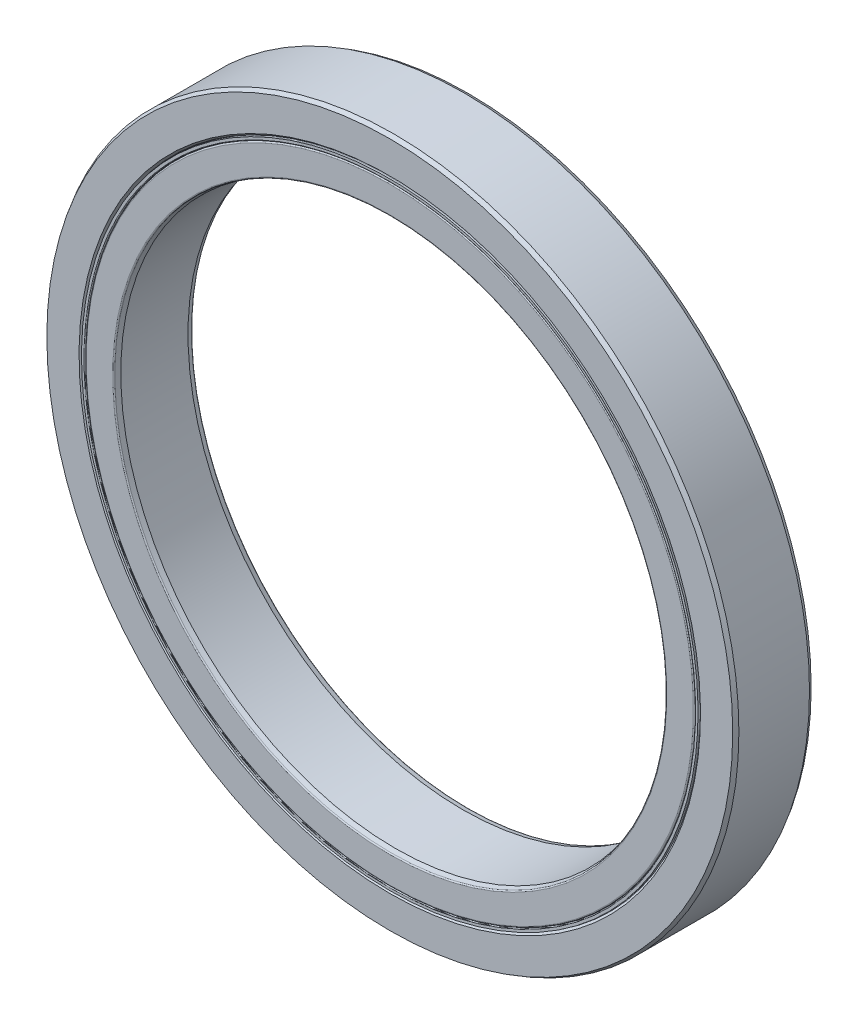
ISO-10303-21;
HEADER;
FILE_DESCRIPTION(('STEP AP214'),'2;1');
FILE_NAME('part.step','',(''),(''),'','','');
FILE_SCHEMA(('AUTOMOTIVE_DESIGN { 1 0 10303 214 1 1 1 1 }'));
ENDSEC;
DATA;
#1=APPLICATION_CONTEXT('core data for automotive mechanical design processes');
#2=APPLICATION_PROTOCOL_DEFINITION('international standard','automotive_design',2000,#1);
#3=PRODUCT_CONTEXT('',#1,'mechanical');
#4=PRODUCT('Part','Part','',(#3));
#5=PRODUCT_RELATED_PRODUCT_CATEGORY('part','',(#4));
#6=PRODUCT_DEFINITION_FORMATION('','',#4);
#7=PRODUCT_DEFINITION_CONTEXT('part definition',#1,'design');
#8=PRODUCT_DEFINITION('design','',#6,#7);
#9=PRODUCT_DEFINITION_SHAPE('','',#8);
#10=(LENGTH_UNIT() NAMED_UNIT(*) SI_UNIT(.MILLI.,.METRE.));
#11=(NAMED_UNIT(*) PLANE_ANGLE_UNIT() SI_UNIT($,.RADIAN.));
#12=(NAMED_UNIT(*) SI_UNIT($,.STERADIAN.) SOLID_ANGLE_UNIT());
#13=UNCERTAINTY_MEASURE_WITH_UNIT(LENGTH_MEASURE(1.E-05),#10,'distance_accuracy_value','');
#14=(GEOMETRIC_REPRESENTATION_CONTEXT(3) GLOBAL_UNCERTAINTY_ASSIGNED_CONTEXT((#13)) GLOBAL_UNIT_ASSIGNED_CONTEXT((#10,
#11,#12)) REPRESENTATION_CONTEXT('',''));
#15=CARTESIAN_POINT('',(0.,0.,0.));
#16=DIRECTION('',(0.,0.,1.));
#17=DIRECTION('',(1.,0.,0.));
#18=AXIS2_PLACEMENT_3D('',#15,#16,#17);
#19=CARTESIAN_POINT('',(0.,19.4316666666665,1.6875));
#20=DIRECTION('',(0.,0.,1.));
#21=DIRECTION('',(0.,-1.,0.));
#22=AXIS2_PLACEMENT_3D('',#19,#20,#21);
#23=PLANE('',#22);
#24=CARTESIAN_POINT('',(0.,0.,1.6875));
#25=DIRECTION('',(0.,0.,1.));
#26=DIRECTION('',(0.,-1.,0.));
#27=AXIS2_PLACEMENT_3D('',#24,#25,#26);
#28=CIRCLE('',#27,19.6116666666665);
#29=CARTESIAN_POINT('',(0.,-19.6116666666665,1.68749999999999));
#30=VERTEX_POINT('',#29);
#31=EDGE_CURVE('E11',#30,#30,#28,.T.);
#32=ORIENTED_EDGE('',*,*,#31,.F.);
#33=EDGE_LOOP('',(#32));
#34=FACE_BOUND('',#33,.T.);
#35=CARTESIAN_POINT('',(0.,0.,1.6875));
#36=DIRECTION('',(0.,0.,1.));
#37=DIRECTION('',(0.,-1.,0.));
#38=AXIS2_PLACEMENT_3D('',#35,#36,#37);
#39=CIRCLE('',#38,19.4316666666665);
#40=CARTESIAN_POINT('',(0.,-19.4316666666665,1.68749999999999));
#41=VERTEX_POINT('',#40);
#42=EDGE_CURVE('E84',#41,#41,#39,.T.);
#43=ORIENTED_EDGE('',*,*,#42,.T.);
#44=EDGE_LOOP('',(#43));
#45=FACE_BOUND('',#44,.T.);
#46=ADVANCED_FACE('F51',(#34,#45),#23,.F.);
#47=CARTESIAN_POINT('',(0.,0.,2.5));
#48=DIRECTION('',(0.,0.,1.));
#49=DIRECTION('',(0.,-1.,0.));
#50=AXIS2_PLACEMENT_3D('',#47,#48,#49);
#51=CYLINDRICAL_SURFACE('',#50,19.6116666666665);
#52=CARTESIAN_POINT('',(0.,0.,2.36643698985866));
#53=DIRECTION('',(0.,0.,1.));
#54=DIRECTION('',(0.,-1.,0.));
#55=AXIS2_PLACEMENT_3D('',#52,#53,#54);
#56=CIRCLE('',#55,19.6116666666665);
#57=CARTESIAN_POINT('',(0.,-19.6116666666665,2.36643698985866));
#58=VERTEX_POINT('',#57);
#59=EDGE_CURVE('E58',#58,#58,#56,.T.);
#60=ORIENTED_EDGE('',*,*,#59,.F.);
#61=EDGE_LOOP('',(#60));
#62=FACE_BOUND('',#61,.T.);
#63=ORIENTED_EDGE('',*,*,#31,.T.);
#64=EDGE_LOOP('',(#63));
#65=FACE_BOUND('',#64,.T.);
#66=ADVANCED_FACE('F117',(#62,#65),#51,.T.);
#67=CARTESIAN_POINT('',(0.,0.,2.36643698985866));
#68=DIRECTION('',(0.,0.,-1.));
#69=DIRECTION('',(0.,1.,0.));
#70=AXIS2_PLACEMENT_3D('',#67,#68,#69);
#71=CONICAL_SURFACE('',#70,19.6116666666665,0.174532925199362);
#72=CARTESIAN_POINT('',(0.,0.,2.41075333874421));
#73=DIRECTION('',(0.,0.,1.));
#74=DIRECTION('',(0.,-1.,0.));
#75=AXIS2_PLACEMENT_3D('',#72,#73,#74);
#76=CIRCLE('',#75,19.6038524986715);
#77=CARTESIAN_POINT('',(0.,-19.6038524986715,2.41075333874421));
#78=VERTEX_POINT('',#77);
#79=EDGE_CURVE('E64',#78,#78,#76,.T.);
#80=ORIENTED_EDGE('',*,*,#79,.F.);
#81=EDGE_LOOP('',(#80));
#82=FACE_BOUND('',#81,.T.);
#83=ORIENTED_EDGE('',*,*,#59,.T.);
#84=EDGE_LOOP('',(#83));
#85=FACE_BOUND('',#84,.T.);
#86=ADVANCED_FACE('F112',(#82,#85),#71,.T.);
#87=CARTESIAN_POINT('',(0.,0.,2.4075));
#88=DIRECTION('',(0.,0.,1.));
#89=DIRECTION('',(0.,-1.,0.));
#90=AXIS2_PLACEMENT_3D('',#87,#88,#89);
#91=TOROIDAL_SURFACE('',#90,19.5854018977984,0.0187352311318617);
#92=CARTESIAN_POINT('',(0.,0.,2.4075));
#93=DIRECTION('',(0.,0.,1.));
#94=DIRECTION('',(0.,-1.,0.));
#95=AXIS2_PLACEMENT_3D('',#92,#93,#94);
#96=CIRCLE('',#95,19.5666666666665);
#97=CARTESIAN_POINT('',(0.,-19.5666666666665,2.4075));
#98=VERTEX_POINT('',#97);
#99=EDGE_CURVE('E70',#98,#98,#96,.T.);
#100=ORIENTED_EDGE('',*,*,#99,.F.);
#101=EDGE_LOOP('',(#100));
#102=FACE_BOUND('',#101,.T.);
#103=ORIENTED_EDGE('',*,*,#79,.T.);
#104=EDGE_LOOP('',(#103));
#105=FACE_BOUND('',#104,.T.);
#106=ADVANCED_FACE('F106',(#102,#105),#91,.T.);
#107=CARTESIAN_POINT('',(0.,0.,2.5));
#108=DIRECTION('',(0.,0.,1.));
#109=DIRECTION('',(0.,-1.,0.));
#110=AXIS2_PLACEMENT_3D('',#107,#108,#109);
#111=CYLINDRICAL_SURFACE('',#110,19.5666666666665);
#112=CARTESIAN_POINT('',(0.,0.,2.4325));
#113=DIRECTION('',(0.,0.,1.));
#114=DIRECTION('',(0.,-1.,0.));
#115=AXIS2_PLACEMENT_3D('',#112,#113,#114);
#116=CIRCLE('',#115,19.5666666666665);
#117=CARTESIAN_POINT('',(0.,-19.5666666666665,2.4325));
#118=VERTEX_POINT('',#117);
#119=EDGE_CURVE('E76',#118,#118,#116,.T.);
#120=ORIENTED_EDGE('',*,*,#119,.F.);
#121=EDGE_LOOP('',(#120));
#122=FACE_BOUND('',#121,.T.);
#123=ORIENTED_EDGE('',*,*,#99,.T.);
#124=EDGE_LOOP('',(#123));
#125=FACE_BOUND('',#124,.T.);
#126=ADVANCED_FACE('F100',(#122,#125),#111,.T.);
#127=CARTESIAN_POINT('',(0.,0.,2.4325));
#128=DIRECTION('',(0.,0.,1.));
#129=DIRECTION('',(0.,-1.,0.));
#130=AXIS2_PLACEMENT_3D('',#127,#128,#129);
#131=TOROIDAL_SURFACE('',#130,19.4991666666665,0.0674999999999981);
#132=CARTESIAN_POINT('',(0.,0.,2.4325));
#133=DIRECTION('',(0.,0.,1.));
#134=DIRECTION('',(0.,-1.,0.));
#135=AXIS2_PLACEMENT_3D('',#132,#133,#134);
#136=CIRCLE('',#135,19.4316666666665);
#137=CARTESIAN_POINT('',(0.,-19.4316666666665,2.4325));
#138=VERTEX_POINT('',#137);
#139=EDGE_CURVE('E80',#138,#138,#136,.T.);
#140=ORIENTED_EDGE('',*,*,#139,.F.);
#141=EDGE_LOOP('',(#140));
#142=FACE_BOUND('',#141,.T.);
#143=ORIENTED_EDGE('',*,*,#119,.T.);
#144=EDGE_LOOP('',(#143));
#145=FACE_BOUND('',#144,.T.);
#146=ADVANCED_FACE('F94',(#142,#145),#131,.T.);
#147=CARTESIAN_POINT('',(0.,0.,2.5));
#148=DIRECTION('',(0.,0.,1.));
#149=DIRECTION('',(0.,-1.,0.));
#150=AXIS2_PLACEMENT_3D('',#147,#148,#149);
#151=CYLINDRICAL_SURFACE('',#150,19.4316666666665);
#152=ORIENTED_EDGE('',*,*,#42,.F.);
#153=EDGE_LOOP('',(#152));
#154=FACE_BOUND('',#153,.T.);
#155=ORIENTED_EDGE('',*,*,#139,.T.);
#156=EDGE_LOOP('',(#155));
#157=FACE_BOUND('',#156,.T.);
#158=ADVANCED_FACE('F91',(#154,#157),#151,.F.);
#159=CLOSED_SHELL('',(#46,#66,#86,#106,#126,#146,#158));
#160=MANIFOLD_SOLID_BREP('B2',#159);
#161=CARTESIAN_POINT('',(0.,0.,-2.3441154273188));
#162=DIRECTION('',(0.,0.,1.));
#163=DIRECTION('',(0.,-1.,0.));
#164=AXIS2_PLACEMENT_3D('',#161,#162,#163);
#165=CONICAL_SURFACE('',#164,19.58,0.523598775598301);
#166=CARTESIAN_POINT('',(0.,0.,-2.5));
#167=DIRECTION('',(0.,0.,1.));
#168=DIRECTION('',(0.,-1.,0.));
#169=AXIS2_PLACEMENT_3D('',#166,#167,#168);
#170=CIRCLE('',#169,19.49);
#171=CARTESIAN_POINT('',(0.,-19.49,-2.50000000000001));
#172=VERTEX_POINT('',#171);
#173=EDGE_CURVE('E222',#172,#172,#170,.T.);
#174=ORIENTED_EDGE('',*,*,#173,.F.);
#175=EDGE_LOOP('',(#174));
#176=FACE_BOUND('',#175,.T.);
#177=CARTESIAN_POINT('',(0.,0.,-2.3441154273188));
#178=DIRECTION('',(0.,0.,1.));
#179=DIRECTION('',(0.,-1.,0.));
#180=AXIS2_PLACEMENT_3D('',#177,#178,#179);
#181=CIRCLE('',#180,19.58);
#182=CARTESIAN_POINT('',(0.,-19.58,-2.34411542731881));
#183=VERTEX_POINT('',#182);
#184=EDGE_CURVE('E50',#183,#183,#181,.T.);
#185=ORIENTED_EDGE('',*,*,#184,.T.);
#186=EDGE_LOOP('',(#185));
#187=FACE_BOUND('',#186,.T.);
#188=ADVANCED_FACE('F193',(#176,#187),#165,.F.);
#189=CARTESIAN_POINT('',(0.,0.,2.5));
#190=DIRECTION('',(0.,0.,1.));
#191=DIRECTION('',(0.,-1.,0.));
#192=AXIS2_PLACEMENT_3D('',#189,#190,#191);
#193=CYLINDRICAL_SURFACE('',#192,19.58);
#194=ORIENTED_EDGE('',*,*,#184,.F.);
#195=EDGE_LOOP('',(#194));
#196=FACE_BOUND('',#195,.T.);
#197=CARTESIAN_POINT('',(0.,0.,-1.6875));
#198=DIRECTION('',(0.,0.,1.));
#199=DIRECTION('',(0.,-1.,0.));
#200=AXIS2_PLACEMENT_3D('',#197,#198,#199);
#201=CIRCLE('',#200,19.58);
#202=CARTESIAN_POINT('',(0.,-19.58,-1.68750000000001));
#203=VERTEX_POINT('',#202);
#204=EDGE_CURVE('E200',#203,#203,#201,.T.);
#205=ORIENTED_EDGE('',*,*,#204,.T.);
#206=EDGE_LOOP('',(#205));
#207=FACE_BOUND('',#206,.T.);
#208=ADVANCED_FACE('F231',(#196,#207),#193,.F.);
#209=CARTESIAN_POINT('',(0.,19.58,-1.6875));
#210=DIRECTION('',(0.,0.,-1.));
#211=DIRECTION('',(0.,1.,0.));
#212=AXIS2_PLACEMENT_3D('',#209,#210,#211);
#213=PLANE('',#212);
#214=ORIENTED_EDGE('',*,*,#204,.F.);
#215=EDGE_LOOP('',(#214));
#216=FACE_BOUND('',#215,.T.);
#217=CARTESIAN_POINT('',(0.,0.,-1.6875));
#218=DIRECTION('',(0.,0.,1.));
#219=DIRECTION('',(0.,-1.,0.));
#220=AXIS2_PLACEMENT_3D('',#217,#218,#219);
#221=CIRCLE('',#220,19.6116666666665);
#222=CARTESIAN_POINT('',(0.,-19.6116666666665,-1.68750000000001));
#223=VERTEX_POINT('',#222);
#224=EDGE_CURVE('E206',#223,#223,#221,.T.);
#225=ORIENTED_EDGE('',*,*,#224,.T.);
#226=EDGE_LOOP('',(#225));
#227=FACE_BOUND('',#226,.T.);
#228=ADVANCED_FACE('F235',(#216,#227),#213,.F.);
#229=CARTESIAN_POINT('',(0.,0.,2.5));
#230=DIRECTION('',(0.,0.,1.));
#231=DIRECTION('',(0.,-1.,0.));
#232=AXIS2_PLACEMENT_3D('',#229,#230,#231);
#233=CYLINDRICAL_SURFACE('',#232,19.6116666666665);
#234=ORIENTED_EDGE('',*,*,#224,.F.);
#235=EDGE_LOOP('',(#234));
#236=FACE_BOUND('',#235,.T.);
#237=CARTESIAN_POINT('',(0.,0.,-2.464));
#238=DIRECTION('',(0.,0.,1.));
#239=DIRECTION('',(0.,-1.,0.));
#240=AXIS2_PLACEMENT_3D('',#237,#238,#239);
#241=CIRCLE('',#240,19.6116666666665);
#242=CARTESIAN_POINT('',(0.,-19.6116666666665,-2.46400000000001));
#243=VERTEX_POINT('',#242);
#244=EDGE_CURVE('E212',#243,#243,#241,.T.);
#245=ORIENTED_EDGE('',*,*,#244,.T.);
#246=EDGE_LOOP('',(#245));
#247=FACE_BOUND('',#246,.T.);
#248=ADVANCED_FACE('F240',(#236,#247),#233,.T.);
#249=CARTESIAN_POINT('',(0.,0.,-2.464));
#250=DIRECTION('',(0.,0.,1.));
#251=DIRECTION('',(0.,-1.,0.));
#252=AXIS2_PLACEMENT_3D('',#249,#250,#251);
#253=TOROIDAL_SURFACE('',#252,19.6476666666665,0.0360000000000024);
#254=ORIENTED_EDGE('',*,*,#244,.F.);
#255=EDGE_LOOP('',(#254));
#256=FACE_BOUND('',#255,.T.);
#257=CARTESIAN_POINT('',(0.,0.,-2.5));
#258=DIRECTION('',(0.,0.,1.));
#259=DIRECTION('',(0.,-1.,0.));
#260=AXIS2_PLACEMENT_3D('',#257,#258,#259);
#261=CIRCLE('',#260,19.6476666666665);
#262=CARTESIAN_POINT('',(0.,-19.6476666666665,-2.50000000000001));
#263=VERTEX_POINT('',#262);
#264=EDGE_CURVE('E218',#263,#263,#261,.T.);
#265=ORIENTED_EDGE('',*,*,#264,.T.);
#266=EDGE_LOOP('',(#265));
#267=FACE_BOUND('',#266,.T.);
#268=ADVANCED_FACE('F246',(#256,#267),#253,.F.);
#269=CARTESIAN_POINT('',(0.,19.49,-2.5));
#270=DIRECTION('',(0.,0.,1.));
#271=DIRECTION('',(0.,-1.,0.));
#272=AXIS2_PLACEMENT_3D('',#269,#270,#271);
#273=PLANE('',#272);
#274=ORIENTED_EDGE('',*,*,#264,.F.);
#275=EDGE_LOOP('',(#274));
#276=FACE_BOUND('',#275,.T.);
#277=ORIENTED_EDGE('',*,*,#173,.T.);
#278=EDGE_LOOP('',(#277));
#279=FACE_BOUND('',#278,.T.);
#280=ADVANCED_FACE('F228',(#276,#279),#273,.F.);
#281=CLOSED_SHELL('',(#188,#208,#228,#248,#268,#280));
#282=MANIFOLD_SOLID_BREP('B6',#281);
#283=CARTESIAN_POINT('',(0.,19.58,1.6875));
#284=DIRECTION('',(0.,0.,1.));
#285=DIRECTION('',(0.,-1.,0.));
#286=AXIS2_PLACEMENT_3D('',#283,#284,#285);
#287=PLANE('',#286);
#288=CARTESIAN_POINT('',(0.,0.,1.6875));
#289=DIRECTION('',(0.,0.,1.));
#290=DIRECTION('',(0.,-1.,0.));
#291=AXIS2_PLACEMENT_3D('',#288,#289,#290);
#292=CIRCLE('',#291,19.6116666666665);
#293=CARTESIAN_POINT('',(0.,-19.6116666666665,1.68749999999999));
#294=VERTEX_POINT('',#293);
#295=EDGE_CURVE('E192',#294,#294,#292,.T.);
#296=ORIENTED_EDGE('',*,*,#295,.F.);
#297=EDGE_LOOP('',(#296));
#298=FACE_BOUND('',#297,.T.);
#299=CARTESIAN_POINT('',(0.,0.,1.6875));
#300=DIRECTION('',(0.,0.,1.));
#301=DIRECTION('',(0.,-1.,0.));
#302=AXIS2_PLACEMENT_3D('',#299,#300,#301);
#303=CIRCLE('',#302,19.58);
#304=CARTESIAN_POINT('',(0.,-19.58,1.68749999999999));
#305=VERTEX_POINT('',#304);
#306=EDGE_CURVE('E343',#305,#305,#303,.T.);
#307=ORIENTED_EDGE('',*,*,#306,.T.);
#308=EDGE_LOOP('',(#307));
#309=FACE_BOUND('',#308,.T.);
#310=ADVANCED_FACE('F314',(#298,#309),#287,.F.);
#311=CARTESIAN_POINT('',(0.,0.,2.5));
#312=DIRECTION('',(0.,0.,1.));
#313=DIRECTION('',(0.,-1.,0.));
#314=AXIS2_PLACEMENT_3D('',#311,#312,#313);
#315=CYLINDRICAL_SURFACE('',#314,19.6116666666665);
#316=CARTESIAN_POINT('',(0.,0.,2.464));
#317=DIRECTION('',(0.,0.,1.));
#318=DIRECTION('',(0.,-1.,0.));
#319=AXIS2_PLACEMENT_3D('',#316,#317,#318);
#320=CIRCLE('',#319,19.6116666666665);
#321=CARTESIAN_POINT('',(0.,-19.6116666666665,2.46399999999999));
#322=VERTEX_POINT('',#321);
#323=EDGE_CURVE('E321',#322,#322,#320,.T.);
#324=ORIENTED_EDGE('',*,*,#323,.F.);
#325=EDGE_LOOP('',(#324));
#326=FACE_BOUND('',#325,.T.);
#327=ORIENTED_EDGE('',*,*,#295,.T.);
#328=EDGE_LOOP('',(#327));
#329=FACE_BOUND('',#328,.T.);
#330=ADVANCED_FACE('F370',(#326,#329),#315,.T.);
#331=CARTESIAN_POINT('',(0.,0.,2.464));
#332=DIRECTION('',(0.,0.,1.));
#333=DIRECTION('',(0.,-1.,0.));
#334=AXIS2_PLACEMENT_3D('',#331,#332,#333);
#335=TOROIDAL_SURFACE('',#334,19.6476666666665,0.0360000000000024);
#336=CARTESIAN_POINT('',(0.,0.,2.5));
#337=DIRECTION('',(0.,0.,1.));
#338=DIRECTION('',(0.,-1.,0.));
#339=AXIS2_PLACEMENT_3D('',#336,#337,#338);
#340=CIRCLE('',#339,19.6476666666665);
#341=CARTESIAN_POINT('',(0.,-19.6476666666665,2.5));
#342=VERTEX_POINT('',#341);
#343=EDGE_CURVE('E327',#342,#342,#340,.T.);
#344=ORIENTED_EDGE('',*,*,#343,.F.);
#345=EDGE_LOOP('',(#344));
#346=FACE_BOUND('',#345,.T.);
#347=ORIENTED_EDGE('',*,*,#323,.T.);
#348=EDGE_LOOP('',(#347));
#349=FACE_BOUND('',#348,.T.);
#350=ADVANCED_FACE('F365',(#346,#349),#335,.F.);
#351=CARTESIAN_POINT('',(0.,19.49,2.5));
#352=DIRECTION('',(0.,0.,-1.));
#353=DIRECTION('',(0.,1.,0.));
#354=AXIS2_PLACEMENT_3D('',#351,#352,#353);
#355=PLANE('',#354);
#356=CARTESIAN_POINT('',(0.,0.,2.5));
#357=DIRECTION('',(0.,0.,1.));
#358=DIRECTION('',(0.,-1.,0.));
#359=AXIS2_PLACEMENT_3D('',#356,#357,#358);
#360=CIRCLE('',#359,19.49);
#361=CARTESIAN_POINT('',(0.,-19.49,2.49999999999999));
#362=VERTEX_POINT('',#361);
#363=EDGE_CURVE('E333',#362,#362,#360,.T.);
#364=ORIENTED_EDGE('',*,*,#363,.F.);
#365=EDGE_LOOP('',(#364));
#366=FACE_BOUND('',#365,.T.);
#367=ORIENTED_EDGE('',*,*,#343,.T.);
#368=EDGE_LOOP('',(#367));
#369=FACE_BOUND('',#368,.T.);
#370=ADVANCED_FACE('F359',(#366,#369),#355,.F.);
#371=CARTESIAN_POINT('',(0.,0.,2.5));
#372=DIRECTION('',(0.,0.,-1.));
#373=DIRECTION('',(0.,1.,0.));
#374=AXIS2_PLACEMENT_3D('',#371,#372,#373);
#375=CONICAL_SURFACE('',#374,19.49,0.523598775598299);
#376=CARTESIAN_POINT('',(0.,0.,2.3441154273188));
#377=DIRECTION('',(0.,0.,1.));
#378=DIRECTION('',(0.,-1.,0.));
#379=AXIS2_PLACEMENT_3D('',#376,#377,#378);
#380=CIRCLE('',#379,19.58);
#381=CARTESIAN_POINT('',(0.,-19.58,2.3441154273188));
#382=VERTEX_POINT('',#381);
#383=EDGE_CURVE('E339',#382,#382,#380,.T.);
#384=ORIENTED_EDGE('',*,*,#383,.F.);
#385=EDGE_LOOP('',(#384));
#386=FACE_BOUND('',#385,.T.);
#387=ORIENTED_EDGE('',*,*,#363,.T.);
#388=EDGE_LOOP('',(#387));
#389=FACE_BOUND('',#388,.T.);
#390=ADVANCED_FACE('F353',(#386,#389),#375,.F.);
#391=CARTESIAN_POINT('',(0.,0.,2.5));
#392=DIRECTION('',(0.,0.,1.));
#393=DIRECTION('',(0.,-1.,0.));
#394=AXIS2_PLACEMENT_3D('',#391,#392,#393);
#395=CYLINDRICAL_SURFACE('',#394,19.58);
#396=ORIENTED_EDGE('',*,*,#306,.F.);
#397=EDGE_LOOP('',(#396));
#398=FACE_BOUND('',#397,.T.);
#399=ORIENTED_EDGE('',*,*,#383,.T.);
#400=EDGE_LOOP('',(#399));
#401=FACE_BOUND('',#400,.T.);
#402=ADVANCED_FACE('F350',(#398,#401),#395,.F.);
#403=CLOSED_SHELL('',(#310,#330,#350,#370,#390,#402));
#404=MANIFOLD_SOLID_BREP('B45',#403);
#405=CARTESIAN_POINT('',(-5.26261085206014,18.7825041207917,0.));
#406=DIRECTION('',(0.,0.,1.));
#407=DIRECTION('',(-0.269796771157012,0.962917287347803,0.));
#408=AXIS2_PLACEMENT_3D('',#405,#406,#407);
#409=SPHERICAL_SURFACE('',#408,1.6875);
#410=CARTESIAN_POINT('',(-5.26261085206014,18.7825041207917,1.6875));
#411=VERTEX_POINT('',#410);
#412=VERTEX_LOOP('',#411);
#413=FACE_BOUND('',#412,.T.);
#414=ADVANCED_FACE('F454',(#413),#409,.T.);
#415=CLOSED_SHELL('',(#414));
#416=MANIFOLD_SOLID_BREP('B187',#415);
#417=CARTESIAN_POINT('',(-10.134917932066,16.6661625018498,0.));
#418=DIRECTION('',(0.,0.,1.));
#419=DIRECTION('',(-0.519583950035423,0.854419404546495,0.));
#420=AXIS2_PLACEMENT_3D('',#417,#418,#419);
#421=SPHERICAL_SURFACE('',#420,1.6875);
#422=CARTESIAN_POINT('',(-10.134917932066,16.6661625018498,1.6875));
#423=VERTEX_POINT('',#422);
#424=VERTEX_LOOP('',#423);
#425=FACE_BOUND('',#424,.T.);
#426=ADVANCED_FACE('F474',(#425),#421,.T.);
#427=CLOSED_SHELL('',(#426));
#428=MANIFOLD_SOLID_BREP('B310',#427);
#429=CARTESIAN_POINT('',(-14.2555645132149,13.313767852766,0.));
#430=DIRECTION('',(0.,0.,1.));
#431=DIRECTION('',(-0.730835964278116,0.682553143218663,0.));
#432=AXIS2_PLACEMENT_3D('',#429,#430,#431);
#433=SPHERICAL_SURFACE('',#432,1.6875);
#434=CARTESIAN_POINT('',(-14.2555645132149,13.313767852766,1.6875));
#435=VERTEX_POINT('',#434);
#436=VERTEX_LOOP('',#435);
#437=FACE_BOUND('',#436,.T.);
#438=ADVANCED_FACE('F494',(#437),#433,.T.);
#439=CLOSED_SHELL('',(#438));
#440=MANIFOLD_SOLID_BREP('B450',#439);
#441=CARTESIAN_POINT('',(-17.3189410892869,8.97395194847775,0.));
#442=DIRECTION('',(0.,0.,1.));
#443=DIRECTION('',(-0.88788521840237,0.460065037731162,0.));
#444=AXIS2_PLACEMENT_3D('',#441,#442,#443);
#445=SPHERICAL_SURFACE('',#444,1.6875);
#446=CARTESIAN_POINT('',(-17.3189410892869,8.97395194847775,1.6875));
#447=VERTEX_POINT('',#446);
#448=VERTEX_LOOP('',#447);
#449=FACE_BOUND('',#448,.T.);
#450=ADVANCED_FACE('F514',(#449),#445,.T.);
#451=CLOSED_SHELL('',(#450));
#452=MANIFOLD_SOLID_BREP('B470',#451);
#453=CARTESIAN_POINT('',(-19.0978510336501,3.96857908126938,0.));
#454=DIRECTION('',(0.,0.,1.));
#455=DIRECTION('',(-0.979084087682321,0.203456013052645,0.));
#456=AXIS2_PLACEMENT_3D('',#453,#454,#455);
#457=SPHERICAL_SURFACE('',#456,1.6875);
#458=CARTESIAN_POINT('',(-19.0978510336501,3.96857908126938,1.68749999999999));
#459=VERTEX_POINT('',#458);
#460=VERTEX_LOOP('',#459);
#461=FACE_BOUND('',#460,.T.);
#462=ADVANCED_FACE('F534',(#461),#457,.T.);
#463=CLOSED_SHELL('',(#462));
#464=MANIFOLD_SOLID_BREP('B490',#463);
#465=CARTESIAN_POINT('',(-19.4603607337025,-1.33112514135551,0.));
#466=DIRECTION('',(0.,0.,1.));
#467=DIRECTION('',(-0.99766876919054,-0.0682424133646607,0.));
#468=AXIS2_PLACEMENT_3D('',#465,#466,#467);
#469=SPHERICAL_SURFACE('',#468,1.6875);
#470=CARTESIAN_POINT('',(-19.4603607337025,-1.33112514135551,1.68749999999999));
#471=VERTEX_POINT('',#470);
#472=VERTEX_LOOP('',#471);
#473=FACE_BOUND('',#472,.T.);
#474=ADVANCED_FACE('F554',(#473),#469,.T.);
#475=CLOSED_SHELL('',(#474));
#476=MANIFOLD_SOLID_BREP('B510',#475);
#477=CARTESIAN_POINT('',(-18.3795845033627,-6.53210590173838,0.));
#478=DIRECTION('',(0.,0.,1.));
#479=DIRECTION('',(-0.942260922118824,-0.334879612170977,0.));
#480=AXIS2_PLACEMENT_3D('',#477,#478,#479);
#481=SPHERICAL_SURFACE('',#480,1.6875);
#482=CARTESIAN_POINT('',(-18.3795845033627,-6.53210590173838,1.68749999999999));
#483=VERTEX_POINT('',#482);
#484=VERTEX_LOOP('',#483);
#485=FACE_BOUND('',#484,.T.);
#486=ADVANCED_FACE('F574',(#485),#481,.T.);
#487=CLOSED_SHELL('',(#486));
#488=MANIFOLD_SOLID_BREP('B530',#487);
#489=CARTESIAN_POINT('',(-15.9356785714129,-11.2486302497854,0.));
#490=DIRECTION('',(0.,0.,1.));
#491=DIRECTION('',(-0.816969893010447,-0.57668032211486,0.));
#492=AXIS2_PLACEMENT_3D('',#489,#490,#491);
#493=SPHERICAL_SURFACE('',#492,1.6875);
#494=CARTESIAN_POINT('',(-15.9356785714129,-11.2486302497854,1.68749999999999));
#495=VERTEX_POINT('',#494);
#496=VERTEX_LOOP('',#495);
#497=FACE_BOUND('',#496,.T.);
#498=ADVANCED_FACE('F594',(#497),#493,.T.);
#499=CLOSED_SHELL('',(#498));
#500=MANIFOLD_SOLID_BREP('B550',#499);
#501=CARTESIAN_POINT('',(-12.3098962607001,-15.1308951512652,0.));
#502=DIRECTION('',(0.,0.,1.));
#503=DIRECTION('',(-0.631087944326059,-0.775711290704414,0.));
#504=AXIS2_PLACEMENT_3D('',#501,#502,#503);
#505=SPHERICAL_SURFACE('',#504,1.6875);
#506=CARTESIAN_POINT('',(-12.3098962607001,-15.1308951512652,1.68749999999999));
#507=VERTEX_POINT('',#506);
#508=VERTEX_LOOP('',#507);
#509=FACE_BOUND('',#508,.T.);
#510=ADVANCED_FACE('F614',(#509),#505,.T.);
#511=CLOSED_SHELL('',(#510));
#512=MANIFOLD_SOLID_BREP('B570',#511);
#513=CARTESIAN_POINT('',(-7.77114525835928,-17.8909707786151,0.));
#514=DIRECTION('',(0.,0.,1.));
#515=DIRECTION('',(-0.398401089846249,-0.91721130150545,0.));
#516=AXIS2_PLACEMENT_3D('',#513,#514,#515);
#517=SPHERICAL_SURFACE('',#516,1.6875);
#518=CARTESIAN_POINT('',(-7.77114525835928,-17.8909707786151,1.68749999999999));
#519=VERTEX_POINT('',#518);
#520=VERTEX_LOOP('',#519);
#521=FACE_BOUND('',#520,.T.);
#522=ADVANCED_FACE('F634',(#521),#517,.T.);
#523=CLOSED_SHELL('',(#522));
#524=MANIFOLD_SOLID_BREP('B590',#523);
#525=CARTESIAN_POINT('',(-2.65604396283001,-19.3241549490603,0.));
#526=DIRECTION('',(0.,0.,1.));
#527=DIRECTION('',(-0.136166649096254,-0.99068594603633,0.));
#528=AXIS2_PLACEMENT_3D('',#525,#526,#527);
#529=SPHERICAL_SURFACE('',#528,1.6875);
#530=CARTESIAN_POINT('',(-2.65604396283001,-19.3241549490603,1.68749999999999));
#531=VERTEX_POINT('',#530);
#532=VERTEX_LOOP('',#531);
#533=FACE_BOUND('',#532,.T.);
#534=ADVANCED_FACE('F654',(#533),#529,.T.);
#535=CLOSED_SHELL('',(#534));
#536=MANIFOLD_SOLID_BREP('B610',#535);
#537=CARTESIAN_POINT('',(2.65604396282974,-19.3241549490603,0.));
#538=DIRECTION('',(0.,0.,1.));
#539=DIRECTION('',(0.13616664909624,-0.990685946036332,0.));
#540=AXIS2_PLACEMENT_3D('',#537,#538,#539);
#541=SPHERICAL_SURFACE('',#540,1.6875);
#542=CARTESIAN_POINT('',(2.65604396282974,-19.3241549490603,1.68749999999999));
#543=VERTEX_POINT('',#542);
#544=VERTEX_LOOP('',#543);
#545=FACE_BOUND('',#544,.T.);
#546=ADVANCED_FACE('F674',(#545),#541,.T.);
#547=CLOSED_SHELL('',(#546));
#548=MANIFOLD_SOLID_BREP('B630',#547);
#549=CARTESIAN_POINT('',(7.77114525835904,-17.8909707786152,0.));
#550=DIRECTION('',(0.,0.,1.));
#551=DIRECTION('',(0.398401089846236,-0.917211301505455,0.));
#552=AXIS2_PLACEMENT_3D('',#549,#550,#551);
#553=SPHERICAL_SURFACE('',#552,1.6875);
#554=CARTESIAN_POINT('',(7.77114525835904,-17.8909707786152,1.68749999999999));
#555=VERTEX_POINT('',#554);
#556=VERTEX_LOOP('',#555);
#557=FACE_BOUND('',#556,.T.);
#558=ADVANCED_FACE('F694',(#557),#553,.T.);
#559=CLOSED_SHELL('',(#558));
#560=MANIFOLD_SOLID_BREP('B650',#559);
#561=CARTESIAN_POINT('',(12.3098962606998,-15.1308951512654,0.));
#562=DIRECTION('',(0.,0.,1.));
#563=DIRECTION('',(0.631087944326049,-0.775711290704423,0.));
#564=AXIS2_PLACEMENT_3D('',#561,#562,#563);
#565=SPHERICAL_SURFACE('',#564,1.6875);
#566=CARTESIAN_POINT('',(12.3098962606998,-15.1308951512654,1.68749999999999));
#567=VERTEX_POINT('',#566);
#568=VERTEX_LOOP('',#567);
#569=FACE_BOUND('',#568,.T.);
#570=ADVANCED_FACE('F714',(#569),#565,.T.);
#571=CLOSED_SHELL('',(#570));
#572=MANIFOLD_SOLID_BREP('B670',#571);
#573=CARTESIAN_POINT('',(15.9356785714128,-11.2486302497857,0.));
#574=DIRECTION('',(0.,0.,1.));
#575=DIRECTION('',(0.816969893010439,-0.576680322114871,0.));
#576=AXIS2_PLACEMENT_3D('',#573,#574,#575);
#577=SPHERICAL_SURFACE('',#576,1.6875);
#578=CARTESIAN_POINT('',(15.9356785714128,-11.2486302497857,1.68749999999999));
#579=VERTEX_POINT('',#578);
#580=VERTEX_LOOP('',#579);
#581=FACE_BOUND('',#580,.T.);
#582=ADVANCED_FACE('F734',(#581),#577,.T.);
#583=CLOSED_SHELL('',(#582));
#584=MANIFOLD_SOLID_BREP('B690',#583);
#585=CARTESIAN_POINT('',(18.3795845033627,-6.53210590173864,0.));
#586=DIRECTION('',(0.,0.,1.));
#587=DIRECTION('',(0.942260922118819,-0.33487961217099,0.));
#588=AXIS2_PLACEMENT_3D('',#585,#586,#587);
#589=SPHERICAL_SURFACE('',#588,1.6875);
#590=CARTESIAN_POINT('',(18.3795845033627,-6.53210590173864,1.68749999999999));
#591=VERTEX_POINT('',#590);
#592=VERTEX_LOOP('',#591);
#593=FACE_BOUND('',#592,.T.);
#594=ADVANCED_FACE('F754',(#593),#589,.T.);
#595=CLOSED_SHELL('',(#594));
#596=MANIFOLD_SOLID_BREP('B710',#595);
#597=CARTESIAN_POINT('',(19.4603607337024,-1.33112514135578,0.));
#598=DIRECTION('',(0.,0.,1.));
#599=DIRECTION('',(0.997668769190539,-0.0682424133646747,0.));
#600=AXIS2_PLACEMENT_3D('',#597,#598,#599);
#601=SPHERICAL_SURFACE('',#600,1.6875);
#602=CARTESIAN_POINT('',(19.4603607337024,-1.33112514135578,1.68749999999999));
#603=VERTEX_POINT('',#602);
#604=VERTEX_LOOP('',#603);
#605=FACE_BOUND('',#604,.T.);
#606=ADVANCED_FACE('F774',(#605),#601,.T.);
#607=CLOSED_SHELL('',(#606));
#608=MANIFOLD_SOLID_BREP('B730',#607);
#609=CARTESIAN_POINT('',(19.0978510336501,3.96857908126911,0.));
#610=DIRECTION('',(0.,0.,1.));
#611=DIRECTION('',(0.979084087682323,0.203456013052631,0.));
#612=AXIS2_PLACEMENT_3D('',#609,#610,#611);
#613=SPHERICAL_SURFACE('',#612,1.6875);
#614=CARTESIAN_POINT('',(19.0978510336501,3.96857908126911,1.68749999999999));
#615=VERTEX_POINT('',#614);
#616=VERTEX_LOOP('',#615);
#617=FACE_BOUND('',#616,.T.);
#618=ADVANCED_FACE('F794',(#617),#613,.T.);
#619=CLOSED_SHELL('',(#618));
#620=MANIFOLD_SOLID_BREP('B750',#619);
#621=CARTESIAN_POINT('',(17.318941089287,8.97395194847752,0.));
#622=DIRECTION('',(0.,0.,1.));
#623=DIRECTION('',(0.887885218402376,0.46006503773115,0.));
#624=AXIS2_PLACEMENT_3D('',#621,#622,#623);
#625=SPHERICAL_SURFACE('',#624,1.6875);
#626=CARTESIAN_POINT('',(17.318941089287,8.97395194847752,1.6875));
#627=VERTEX_POINT('',#626);
#628=VERTEX_LOOP('',#627);
#629=FACE_BOUND('',#628,.T.);
#630=ADVANCED_FACE('F814',(#629),#625,.T.);
#631=CLOSED_SHELL('',(#630));
#632=MANIFOLD_SOLID_BREP('B770',#631);
#633=CARTESIAN_POINT('',(14.2555645132151,13.3137678527658,0.));
#634=DIRECTION('',(0.,0.,1.));
#635=DIRECTION('',(0.730835964278125,0.682553143218653,0.));
#636=AXIS2_PLACEMENT_3D('',#633,#634,#635);
#637=SPHERICAL_SURFACE('',#636,1.6875);
#638=CARTESIAN_POINT('',(14.2555645132151,13.3137678527658,1.6875));
#639=VERTEX_POINT('',#638);
#640=VERTEX_LOOP('',#639);
#641=FACE_BOUND('',#640,.T.);
#642=ADVANCED_FACE('F834',(#641),#637,.T.);
#643=CLOSED_SHELL('',(#642));
#644=MANIFOLD_SOLID_BREP('B790',#643);
#645=CARTESIAN_POINT('',(10.1349179320662,16.6661625018497,0.));
#646=DIRECTION('',(0.,0.,1.));
#647=DIRECTION('',(0.519583950035435,0.854419404546488,0.));
#648=AXIS2_PLACEMENT_3D('',#645,#646,#647);
#649=SPHERICAL_SURFACE('',#648,1.6875);
#650=CARTESIAN_POINT('',(10.1349179320662,16.6661625018497,1.6875));
#651=VERTEX_POINT('',#650);
#652=VERTEX_LOOP('',#651);
#653=FACE_BOUND('',#652,.T.);
#654=ADVANCED_FACE('F854',(#653),#649,.T.);
#655=CLOSED_SHELL('',(#654));
#656=MANIFOLD_SOLID_BREP('B810',#655);
#657=CARTESIAN_POINT('',(5.2626108520604,18.7825041207916,0.));
#658=DIRECTION('',(0.,0.,1.));
#659=DIRECTION('',(0.269796771157025,0.962917287347799,0.));
#660=AXIS2_PLACEMENT_3D('',#657,#658,#659);
#661=SPHERICAL_SURFACE('',#660,1.6875);
#662=CARTESIAN_POINT('',(5.2626108520604,18.7825041207916,1.6875));
#663=VERTEX_POINT('',#662);
#664=VERTEX_LOOP('',#663);
#665=FACE_BOUND('',#664,.T.);
#666=ADVANCED_FACE('F874',(#665),#661,.T.);
#667=CLOSED_SHELL('',(#666));
#668=MANIFOLD_SOLID_BREP('B830',#667);
#669=CARTESIAN_POINT('',(0.,19.5058333333333,0.));
#670=DIRECTION('',(0.,0.,1.));
#671=DIRECTION('',(0.,1.,0.));
#672=AXIS2_PLACEMENT_3D('',#669,#670,#671);
#673=SPHERICAL_SURFACE('',#672,1.6875);
#674=CARTESIAN_POINT('',(0.,19.5058333333333,1.6875));
#675=VERTEX_POINT('',#674);
#676=VERTEX_LOOP('',#675);
#677=FACE_BOUND('',#676,.T.);
#678=ADVANCED_FACE('F896',(#677),#673,.T.);
#679=CLOSED_SHELL('',(#678));
#680=MANIFOLD_SOLID_BREP('B850',#679);
#681=CARTESIAN_POINT('',(0.,0.,-2.41760927064237));
#682=DIRECTION('',(0.,0.,1.));
#683=DIRECTION('',(0.,-1.,0.));
#684=AXIS2_PLACEMENT_3D('',#681,#682,#683);
#685=TOROIDAL_SURFACE('',#684,17.6591666666667,0.0823907293576316);
#686=CARTESIAN_POINT('',(0.,0.,-2.5));
#687=DIRECTION('',(0.,0.,1.));
#688=DIRECTION('',(0.,-1.,0.));
#689=AXIS2_PLACEMENT_3D('',#686,#687,#688);
#690=CIRCLE('',#689,17.6591666666667);
#691=CARTESIAN_POINT('',(0.,-17.6591666666667,-2.50000000000001));
#692=VERTEX_POINT('',#691);
#693=EDGE_CURVE('E895',#692,#692,#690,.T.);
#694=ORIENTED_EDGE('',*,*,#693,.F.);
#695=EDGE_LOOP('',(#694));
#696=FACE_BOUND('',#695,.T.);
#697=CARTESIAN_POINT('',(0.,0.,-2.43893356054001));
#698=DIRECTION('',(0.,0.,1.));
#699=DIRECTION('',(0.,-1.,0.));
#700=AXIS2_PLACEMENT_3D('',#697,#698,#699);
#701=CIRCLE('',#700,17.5795833333333);
#702=CARTESIAN_POINT('',(0.,-17.5795833333333,-2.43893356054002));
#703=VERTEX_POINT('',#702);
#704=EDGE_CURVE('E970',#703,#703,#701,.T.);
#705=ORIENTED_EDGE('',*,*,#704,.T.);
#706=EDGE_LOOP('',(#705));
#707=FACE_BOUND('',#706,.T.);
#708=ADVANCED_FACE('F917',(#696,#707),#685,.T.);
#709=CARTESIAN_POINT('',(0.,17.6591666666667,-2.5));
#710=DIRECTION('',(0.,0.,1.));
#711=DIRECTION('',(0.,-1.,0.));
#712=AXIS2_PLACEMENT_3D('',#709,#710,#711);
#713=PLANE('',#712);
#714=CARTESIAN_POINT('',(0.,0.,-2.50000000000001));
#715=DIRECTION('',(0.,0.,1.));
#716=DIRECTION('',(0.,-1.,0.));
#717=AXIS2_PLACEMENT_3D('',#714,#715,#716);
#718=CIRCLE('',#717,19.3492759373089);
#719=CARTESIAN_POINT('',(0.,-19.3492759373089,-2.50000000000001));
#720=VERTEX_POINT('',#719);
#721=EDGE_CURVE('E924',#720,#720,#718,.T.);
#722=ORIENTED_EDGE('',*,*,#721,.F.);
#723=EDGE_LOOP('',(#722));
#724=FACE_BOUND('',#723,.T.);
#725=ORIENTED_EDGE('',*,*,#693,.T.);
#726=EDGE_LOOP('',(#725));
#727=FACE_BOUND('',#726,.T.);
#728=ADVANCED_FACE('F1033',(#724,#727),#713,.F.);
#729=CARTESIAN_POINT('',(0.,0.,-2.41760927064237));
#730=DIRECTION('',(0.,0.,1.));
#731=DIRECTION('',(0.,-1.,0.));
#732=AXIS2_PLACEMENT_3D('',#729,#730,#731);
#733=TOROIDAL_SURFACE('',#732,19.3492759373089,0.0823907293576341);
#734=CARTESIAN_POINT('',(0.,0.,-2.41760927064237));
#735=DIRECTION('',(0.,0.,1.));
#736=DIRECTION('',(0.,-1.,0.));
#737=AXIS2_PLACEMENT_3D('',#734,#735,#736);
#738=CIRCLE('',#737,19.4316666666665);
#739=CARTESIAN_POINT('',(0.,-19.4316666666665,-2.41760927064237));
#740=VERTEX_POINT('',#739);
#741=EDGE_CURVE('E930',#740,#740,#738,.T.);
#742=ORIENTED_EDGE('',*,*,#741,.F.);
#743=EDGE_LOOP('',(#742));
#744=FACE_BOUND('',#743,.T.);
#745=ORIENTED_EDGE('',*,*,#721,.T.);
#746=EDGE_LOOP('',(#745));
#747=FACE_BOUND('',#746,.T.);
#748=ADVANCED_FACE('F1028',(#744,#747),#733,.T.);
#749=CARTESIAN_POINT('',(0.,0.,2.5));
#750=DIRECTION('',(0.,0.,1.));
#751=DIRECTION('',(0.,-1.,0.));
#752=AXIS2_PLACEMENT_3D('',#749,#750,#751);
#753=CYLINDRICAL_SURFACE('',#752,19.4316666666665);
#754=CARTESIAN_POINT('',(0.,0.,-1.68586937677732));
#755=DIRECTION('',(0.,0.,1.));
#756=DIRECTION('',(0.,-1.,0.));
#757=AXIS2_PLACEMENT_3D('',#754,#755,#756);
#758=CIRCLE('',#757,19.4316666666665);
#759=CARTESIAN_POINT('',(0.,-19.4316666666665,-1.68586937677732));
#760=VERTEX_POINT('',#759);
#761=EDGE_CURVE('E936',#760,#760,#758,.T.);
#762=ORIENTED_EDGE('',*,*,#761,.F.);
#763=EDGE_LOOP('',(#762));
#764=FACE_BOUND('',#763,.T.);
#765=ORIENTED_EDGE('',*,*,#741,.T.);
#766=EDGE_LOOP('',(#765));
#767=FACE_BOUND('',#766,.T.);
#768=ADVANCED_FACE('F1022',(#764,#767),#753,.T.);
#769=CARTESIAN_POINT('',(0.,0.,0.));
#770=DIRECTION('',(0.,0.,1.));
#771=DIRECTION('',(0.,-1.,0.));
#772=AXIS2_PLACEMENT_3D('',#769,#770,#771);
#773=TOROIDAL_SURFACE('',#772,19.5058333333333,1.6875);
#774=CARTESIAN_POINT('',(0.,0.,1.68586937677731));
#775=DIRECTION('',(0.,0.,1.));
#776=DIRECTION('',(0.,-1.,0.));
#777=AXIS2_PLACEMENT_3D('',#774,#775,#776);
#778=CIRCLE('',#777,19.4316666666665);
#779=CARTESIAN_POINT('',(0.,-19.4316666666665,1.68586937677731));
#780=VERTEX_POINT('',#779);
#781=EDGE_CURVE('E942',#780,#780,#778,.T.);
#782=ORIENTED_EDGE('',*,*,#781,.F.);
#783=EDGE_LOOP('',(#782));
#784=FACE_BOUND('',#783,.T.);
#785=ORIENTED_EDGE('',*,*,#761,.T.);
#786=EDGE_LOOP('',(#785));
#787=FACE_BOUND('',#786,.T.);
#788=ADVANCED_FACE('F1016',(#784,#787),#773,.F.);
#789=CARTESIAN_POINT('',(0.,0.,2.5));
#790=DIRECTION('',(0.,0.,1.));
#791=DIRECTION('',(0.,-1.,0.));
#792=AXIS2_PLACEMENT_3D('',#789,#790,#791);
#793=CYLINDRICAL_SURFACE('',#792,19.4316666666665);
#794=CARTESIAN_POINT('',(0.,0.,2.41760927064236));
#795=DIRECTION('',(0.,0.,1.));
#796=DIRECTION('',(0.,-1.,0.));
#797=AXIS2_PLACEMENT_3D('',#794,#795,#796);
#798=CIRCLE('',#797,19.4316666666665);
#799=CARTESIAN_POINT('',(0.,-19.4316666666665,2.41760927064236));
#800=VERTEX_POINT('',#799);
#801=EDGE_CURVE('E946',#800,#800,#798,.T.);
#802=ORIENTED_EDGE('',*,*,#801,.F.);
#803=EDGE_LOOP('',(#802));
#804=FACE_BOUND('',#803,.T.);
#805=ORIENTED_EDGE('',*,*,#781,.T.);
#806=EDGE_LOOP('',(#805));
#807=FACE_BOUND('',#806,.T.);
#808=ADVANCED_FACE('F1010',(#804,#807),#793,.T.);
#809=CARTESIAN_POINT('',(0.,0.,2.41760927064236));
#810=DIRECTION('',(0.,0.,1.));
#811=DIRECTION('',(0.,-1.,0.));
#812=AXIS2_PLACEMENT_3D('',#809,#810,#811);
#813=TOROIDAL_SURFACE('',#812,19.3492759373089,0.0823907293576341);
#814=CARTESIAN_POINT('',(0.,0.,2.5));
#815=DIRECTION('',(0.,0.,1.));
#816=DIRECTION('',(0.,-1.,0.));
#817=AXIS2_PLACEMENT_3D('',#814,#815,#816);
#818=CIRCLE('',#817,19.3492759373089);
#819=CARTESIAN_POINT('',(0.,-19.3492759373089,2.49999999999999));
#820=VERTEX_POINT('',#819);
#821=EDGE_CURVE('E950',#820,#820,#818,.T.);
#822=ORIENTED_EDGE('',*,*,#821,.F.);
#823=EDGE_LOOP('',(#822));
#824=FACE_BOUND('',#823,.T.);
#825=ORIENTED_EDGE('',*,*,#801,.T.);
#826=EDGE_LOOP('',(#825));
#827=FACE_BOUND('',#826,.T.);
#828=ADVANCED_FACE('F1004',(#824,#827),#813,.T.);
#829=CARTESIAN_POINT('',(0.,17.6591666666667,2.5));
#830=DIRECTION('',(0.,0.,-1.));
#831=DIRECTION('',(0.,1.,0.));
#832=AXIS2_PLACEMENT_3D('',#829,#830,#831);
#833=PLANE('',#832);
#834=CARTESIAN_POINT('',(0.,0.,2.5));
#835=DIRECTION('',(0.,0.,1.));
#836=DIRECTION('',(0.,-1.,0.));
#837=AXIS2_PLACEMENT_3D('',#834,#835,#836);
#838=CIRCLE('',#837,17.6591666666667);
#839=CARTESIAN_POINT('',(0.,-17.6591666666667,2.5));
#840=VERTEX_POINT('',#839);
#841=EDGE_CURVE('E954',#840,#840,#838,.T.);
#842=ORIENTED_EDGE('',*,*,#841,.F.);
#843=EDGE_LOOP('',(#842));
#844=FACE_BOUND('',#843,.T.);
#845=ORIENTED_EDGE('',*,*,#821,.T.);
#846=EDGE_LOOP('',(#845));
#847=FACE_BOUND('',#846,.T.);
#848=ADVANCED_FACE('F998',(#844,#847),#833,.F.);
#849=CARTESIAN_POINT('',(0.,0.,2.41760927064237));
#850=DIRECTION('',(0.,0.,1.));
#851=DIRECTION('',(0.,-1.,0.));
#852=AXIS2_PLACEMENT_3D('',#849,#850,#851);
#853=TOROIDAL_SURFACE('',#852,17.6591666666667,0.0823907293576333);
#854=CARTESIAN_POINT('',(0.,0.,2.43893356054001));
#855=DIRECTION('',(0.,0.,1.));
#856=DIRECTION('',(0.,-1.,0.));
#857=AXIS2_PLACEMENT_3D('',#854,#855,#856);
#858=CIRCLE('',#857,17.5795833333333);
#859=CARTESIAN_POINT('',(0.,-17.5795833333333,2.43893356054001));
#860=VERTEX_POINT('',#859);
#861=EDGE_CURVE('E958',#860,#860,#858,.T.);
#862=ORIENTED_EDGE('',*,*,#861,.F.);
#863=EDGE_LOOP('',(#862));
#864=FACE_BOUND('',#863,.T.);
#865=ORIENTED_EDGE('',*,*,#841,.T.);
#866=EDGE_LOOP('',(#865));
#867=FACE_BOUND('',#866,.T.);
#868=ADVANCED_FACE('F992',(#864,#867),#853,.T.);
#869=CARTESIAN_POINT('',(0.,0.,2.43893356054001));
#870=DIRECTION('',(0.,0.,1.));
#871=DIRECTION('',(0.,-1.,0.));
#872=AXIS2_PLACEMENT_3D('',#869,#870,#871);
#873=CONICAL_SURFACE('',#872,17.5795833333333,0.261799387799156);
#874=CARTESIAN_POINT('',(0.,0.,2.14192451710432));
#875=DIRECTION('',(0.,0.,1.));
#876=DIRECTION('',(0.,-1.,0.));
#877=AXIS2_PLACEMENT_3D('',#874,#875,#876);
#878=CIRCLE('',#877,17.5);
#879=CARTESIAN_POINT('',(0.,-17.5,2.14192451710432));
#880=VERTEX_POINT('',#879);
#881=EDGE_CURVE('E962',#880,#880,#878,.T.);
#882=ORIENTED_EDGE('',*,*,#881,.F.);
#883=EDGE_LOOP('',(#882));
#884=FACE_BOUND('',#883,.T.);
#885=ORIENTED_EDGE('',*,*,#861,.T.);
#886=EDGE_LOOP('',(#885));
#887=FACE_BOUND('',#886,.T.);
#888=ADVANCED_FACE('F986',(#884,#887),#873,.F.);
#889=CARTESIAN_POINT('',(0.,0.,2.5));
#890=DIRECTION('',(0.,0.,1.));
#891=DIRECTION('',(0.,-1.,0.));
#892=AXIS2_PLACEMENT_3D('',#889,#890,#891);
#893=CYLINDRICAL_SURFACE('',#892,17.5);
#894=CARTESIAN_POINT('',(0.,0.,-2.14192451710433));
#895=DIRECTION('',(0.,0.,1.));
#896=DIRECTION('',(0.,-1.,0.));
#897=AXIS2_PLACEMENT_3D('',#894,#895,#896);
#898=CIRCLE('',#897,17.5);
#899=CARTESIAN_POINT('',(0.,-17.5,-2.14192451710433));
#900=VERTEX_POINT('',#899);
#901=EDGE_CURVE('E966',#900,#900,#898,.T.);
#902=ORIENTED_EDGE('',*,*,#901,.F.);
#903=EDGE_LOOP('',(#902));
#904=FACE_BOUND('',#903,.T.);
#905=ORIENTED_EDGE('',*,*,#881,.T.);
#906=EDGE_LOOP('',(#905));
#907=FACE_BOUND('',#906,.T.);
#908=ADVANCED_FACE('F980',(#904,#907),#893,.F.);
#909=CARTESIAN_POINT('',(0.,0.,-2.14192451710433));
#910=DIRECTION('',(0.,0.,-1.));
#911=DIRECTION('',(0.,1.,0.));
#912=AXIS2_PLACEMENT_3D('',#909,#910,#911);
#913=CONICAL_SURFACE('',#912,17.5,0.261799387799156);
#914=ORIENTED_EDGE('',*,*,#704,.F.);
#915=EDGE_LOOP('',(#914));
#916=FACE_BOUND('',#915,.T.);
#917=ORIENTED_EDGE('',*,*,#901,.T.);
#918=EDGE_LOOP('',(#917));
#919=FACE_BOUND('',#918,.T.);
#920=ADVANCED_FACE('F977',(#916,#919),#913,.F.);
#921=CLOSED_SHELL('',(#708,#728,#748,#768,#788,#808,#828,#848,#868,#888,#908,#920));
#922=MANIFOLD_SOLID_BREP('B870',#921);
#923=CARTESIAN_POINT('',(0.,0.,2.5));
#924=DIRECTION('',(0.,0.,1.));
#925=DIRECTION('',(0.,-1.,0.));
#926=AXIS2_PLACEMENT_3D('',#923,#924,#925);
#927=CYLINDRICAL_SURFACE('',#926,19.58);
#928=CARTESIAN_POINT('',(0.,0.,1.68586937677732));
#929=DIRECTION('',(0.,0.,1.));
#930=DIRECTION('',(0.,-1.,0.));
#931=AXIS2_PLACEMENT_3D('',#928,#929,#930);
#932=CIRCLE('',#931,19.58);
#933=CARTESIAN_POINT('',(0.,-19.58,1.68586937677731));
#934=VERTEX_POINT('',#933);
#935=EDGE_CURVE('E916',#934,#934,#932,.T.);
#936=ORIENTED_EDGE('',*,*,#935,.F.);
#937=EDGE_LOOP('',(#936));
#938=FACE_BOUND('',#937,.T.);
#939=CARTESIAN_POINT('',(0.,0.,2.10373410621688));
#940=DIRECTION('',(0.,0.,1.));
#941=DIRECTION('',(0.,-1.,0.));
#942=AXIS2_PLACEMENT_3D('',#939,#940,#941);
#943=CIRCLE('',#942,19.58);
#944=CARTESIAN_POINT('',(0.,-19.58,2.10373410621687));
#945=VERTEX_POINT('',#944);
#946=EDGE_CURVE('E1199',#945,#945,#943,.T.);
#947=ORIENTED_EDGE('',*,*,#946,.T.);
#948=EDGE_LOOP('',(#947));
#949=FACE_BOUND('',#948,.T.);
#950=ADVANCED_FACE('F1146',(#938,#949),#927,.F.);
#951=CARTESIAN_POINT('',(0.,0.,0.));
#952=DIRECTION('',(0.,0.,1.));
#953=DIRECTION('',(0.,-1.,0.));
#954=AXIS2_PLACEMENT_3D('',#951,#952,#953);
#955=TOROIDAL_SURFACE('',#954,19.5058333333333,1.6875);
#956=CARTESIAN_POINT('',(0.,0.,-1.68586937677732));
#957=DIRECTION('',(0.,0.,1.));
#958=DIRECTION('',(0.,-1.,0.));
#959=AXIS2_PLACEMENT_3D('',#956,#957,#958);
#960=CIRCLE('',#959,19.58);
#961=CARTESIAN_POINT('',(0.,-19.58,-1.68586937677732));
#962=VERTEX_POINT('',#961);
#963=EDGE_CURVE('E1153',#962,#962,#960,.T.);
#964=ORIENTED_EDGE('',*,*,#963,.F.);
#965=EDGE_LOOP('',(#964));
#966=FACE_BOUND('',#965,.T.);
#967=ORIENTED_EDGE('',*,*,#935,.T.);
#968=EDGE_LOOP('',(#967));
#969=FACE_BOUND('',#968,.T.);
#970=ADVANCED_FACE('F1262',(#966,#969),#955,.F.);
#971=CARTESIAN_POINT('',(0.,0.,2.5));
#972=DIRECTION('',(0.,0.,1.));
#973=DIRECTION('',(0.,-1.,0.));
#974=AXIS2_PLACEMENT_3D('',#971,#972,#973);
#975=CYLINDRICAL_SURFACE('',#974,19.58);
#976=CARTESIAN_POINT('',(0.,0.,-2.10373410621688));
#977=DIRECTION('',(0.,0.,1.));
#978=DIRECTION('',(0.,-1.,0.));
#979=AXIS2_PLACEMENT_3D('',#976,#977,#978);
#980=CIRCLE('',#979,19.58);
#981=CARTESIAN_POINT('',(0.,-19.58,-2.10373410621688));
#982=VERTEX_POINT('',#981);
#983=EDGE_CURVE('E1159',#982,#982,#980,.T.);
#984=ORIENTED_EDGE('',*,*,#983,.F.);
#985=EDGE_LOOP('',(#984));
#986=FACE_BOUND('',#985,.T.);
#987=ORIENTED_EDGE('',*,*,#963,.T.);
#988=EDGE_LOOP('',(#987));
#989=FACE_BOUND('',#988,.T.);
#990=ADVANCED_FACE('F1257',(#986,#989),#975,.F.);
#991=CARTESIAN_POINT('',(0.,0.,-2.10373410621688));
#992=DIRECTION('',(0.,0.,-1.));
#993=DIRECTION('',(0.,1.,0.));
#994=AXIS2_PLACEMENT_3D('',#991,#992,#993);
#995=CONICAL_SURFACE('',#994,19.58,0.349065850398861);
#996=CARTESIAN_POINT('',(0.,0.,-2.375));
#997=DIRECTION('',(0.,0.,1.));
#998=DIRECTION('',(0.,-1.,0.));
#999=AXIS2_PLACEMENT_3D('',#996,#997,#998);
#1000=CIRCLE('',#999,19.6787327109087);
#1001=CARTESIAN_POINT('',(0.,-19.6787327109087,-2.37500000000001));
#1002=VERTEX_POINT('',#1001);
#1003=EDGE_CURVE('E1165',#1002,#1002,#1000,.T.);
#1004=ORIENTED_EDGE('',*,*,#1003,.F.);
#1005=EDGE_LOOP('',(#1004));
#1006=FACE_BOUND('',#1005,.T.);
#1007=ORIENTED_EDGE('',*,*,#983,.T.);
#1008=EDGE_LOOP('',(#1007));
#1009=FACE_BOUND('',#1008,.T.);
#1010=ADVANCED_FACE('F1251',(#1006,#1009),#995,.F.);
#1011=CARTESIAN_POINT('',(0.,0.,-2.375));
#1012=DIRECTION('',(0.,0.,-1.));
#1013=DIRECTION('',(0.,1.,0.));
#1014=AXIS2_PLACEMENT_3D('',#1011,#1012,#1013);
#1015=CONICAL_SURFACE('',#1014,19.6787327109087,0.785398163397455);
#1016=CARTESIAN_POINT('',(0.,0.,-2.50000000000001));
#1017=DIRECTION('',(0.,0.,1.));
#1018=DIRECTION('',(0.,-1.,0.));
#1019=AXIS2_PLACEMENT_3D('',#1016,#1017,#1018);
#1020=CIRCLE('',#1019,19.8037327109087);
#1021=CARTESIAN_POINT('',(0.,-19.8037327109087,-2.50000000000001));
#1022=VERTEX_POINT('',#1021);
#1023=EDGE_CURVE('E1171',#1022,#1022,#1020,.T.);
#1024=ORIENTED_EDGE('',*,*,#1023,.F.);
#1025=EDGE_LOOP('',(#1024));
#1026=FACE_BOUND('',#1025,.T.);
#1027=ORIENTED_EDGE('',*,*,#1003,.T.);
#1028=EDGE_LOOP('',(#1027));
#1029=FACE_BOUND('',#1028,.T.);
#1030=ADVANCED_FACE('F1245',(#1026,#1029),#1015,.F.);
#1031=CARTESIAN_POINT('',(0.,21.8556624327026,-2.5));
#1032=DIRECTION('',(0.,0.,1.));
#1033=DIRECTION('',(0.,-1.,0.));
#1034=AXIS2_PLACEMENT_3D('',#1031,#1032,#1033);
#1035=PLANE('',#1034);
#1036=CARTESIAN_POINT('',(0.,0.,-2.50000000000001));
#1037=DIRECTION('',(0.,0.,1.));
#1038=DIRECTION('',(0.,-1.,0.));
#1039=AXIS2_PLACEMENT_3D('',#1036,#1037,#1038);
#1040=CIRCLE('',#1039,21.8556624327026);
#1041=CARTESIAN_POINT('',(0.,-21.8556624327026,-2.50000000000001));
#1042=VERTEX_POINT('',#1041);
#1043=EDGE_CURVE('E1175',#1042,#1042,#1040,.T.);
#1044=ORIENTED_EDGE('',*,*,#1043,.F.);
#1045=EDGE_LOOP('',(#1044));
#1046=FACE_BOUND('',#1045,.T.);
#1047=ORIENTED_EDGE('',*,*,#1023,.T.);
#1048=EDGE_LOOP('',(#1047));
#1049=FACE_BOUND('',#1048,.T.);
#1050=ADVANCED_FACE('F1239',(#1046,#1049),#1035,.F.);
#1051=CARTESIAN_POINT('',(0.,0.,-2.50000000000001));
#1052=DIRECTION('',(0.,0.,1.));
#1053=DIRECTION('',(0.,-1.,0.));
#1054=AXIS2_PLACEMENT_3D('',#1051,#1052,#1053);
#1055=CONICAL_SURFACE('',#1054,21.8556624327026,0.523598775598294);
#1056=CARTESIAN_POINT('',(0.,0.,-2.25000000000001));
#1057=DIRECTION('',(0.,0.,1.));
#1058=DIRECTION('',(0.,-1.,0.));
#1059=AXIS2_PLACEMENT_3D('',#1056,#1057,#1058);
#1060=CIRCLE('',#1059,22.);
#1061=CARTESIAN_POINT('',(0.,-22.,-2.25000000000001));
#1062=VERTEX_POINT('',#1061);
#1063=EDGE_CURVE('E1179',#1062,#1062,#1060,.T.);
#1064=ORIENTED_EDGE('',*,*,#1063,.F.);
#1065=EDGE_LOOP('',(#1064));
#1066=FACE_BOUND('',#1065,.T.);
#1067=ORIENTED_EDGE('',*,*,#1043,.T.);
#1068=EDGE_LOOP('',(#1067));
#1069=FACE_BOUND('',#1068,.T.);
#1070=ADVANCED_FACE('F1233',(#1066,#1069),#1055,.T.);
#1071=CARTESIAN_POINT('',(0.,0.,2.5));
#1072=DIRECTION('',(0.,0.,1.));
#1073=DIRECTION('',(0.,-1.,0.));
#1074=AXIS2_PLACEMENT_3D('',#1071,#1072,#1073);
#1075=CYLINDRICAL_SURFACE('',#1074,22.);
#1076=CARTESIAN_POINT('',(0.,0.,2.25));
#1077=DIRECTION('',(0.,0.,1.));
#1078=DIRECTION('',(0.,-1.,0.));
#1079=AXIS2_PLACEMENT_3D('',#1076,#1077,#1078);
#1080=CIRCLE('',#1079,22.);
#1081=CARTESIAN_POINT('',(0.,-22.,2.25));
#1082=VERTEX_POINT('',#1081);
#1083=EDGE_CURVE('E1183',#1082,#1082,#1080,.T.);
#1084=ORIENTED_EDGE('',*,*,#1083,.F.);
#1085=EDGE_LOOP('',(#1084));
#1086=FACE_BOUND('',#1085,.T.);
#1087=ORIENTED_EDGE('',*,*,#1063,.T.);
#1088=EDGE_LOOP('',(#1087));
#1089=FACE_BOUND('',#1088,.T.);
#1090=ADVANCED_FACE('F1227',(#1086,#1089),#1075,.T.);
#1091=CARTESIAN_POINT('',(0.,0.,2.25));
#1092=DIRECTION('',(0.,0.,-1.));
#1093=DIRECTION('',(0.,1.,0.));
#1094=AXIS2_PLACEMENT_3D('',#1091,#1092,#1093);
#1095=CONICAL_SURFACE('',#1094,22.,0.523598775598294);
#1096=CARTESIAN_POINT('',(0.,0.,2.5));
#1097=DIRECTION('',(0.,0.,1.));
#1098=DIRECTION('',(0.,-1.,0.));
#1099=AXIS2_PLACEMENT_3D('',#1096,#1097,#1098);
#1100=CIRCLE('',#1099,21.8556624327026);
#1101=CARTESIAN_POINT('',(0.,-21.8556624327026,2.5));
#1102=VERTEX_POINT('',#1101);
#1103=EDGE_CURVE('E1187',#1102,#1102,#1100,.T.);
#1104=ORIENTED_EDGE('',*,*,#1103,.F.);
#1105=EDGE_LOOP('',(#1104));
#1106=FACE_BOUND('',#1105,.T.);
#1107=ORIENTED_EDGE('',*,*,#1083,.T.);
#1108=EDGE_LOOP('',(#1107));
#1109=FACE_BOUND('',#1108,.T.);
#1110=ADVANCED_FACE('F1221',(#1106,#1109),#1095,.T.);
#1111=CARTESIAN_POINT('',(0.,21.8556624327026,2.5));
#1112=DIRECTION('',(0.,0.,-1.));
#1113=DIRECTION('',(0.,1.,0.));
#1114=AXIS2_PLACEMENT_3D('',#1111,#1112,#1113);
#1115=PLANE('',#1114);
#1116=CARTESIAN_POINT('',(0.,0.,2.5));
#1117=DIRECTION('',(0.,0.,1.));
#1118=DIRECTION('',(0.,-1.,0.));
#1119=AXIS2_PLACEMENT_3D('',#1116,#1117,#1118);
#1120=CIRCLE('',#1119,19.8037327109087);
#1121=CARTESIAN_POINT('',(0.,-19.8037327109087,2.5));
#1122=VERTEX_POINT('',#1121);
#1123=EDGE_CURVE('E1191',#1122,#1122,#1120,.T.);
#1124=ORIENTED_EDGE('',*,*,#1123,.F.);
#1125=EDGE_LOOP('',(#1124));
#1126=FACE_BOUND('',#1125,.T.);
#1127=ORIENTED_EDGE('',*,*,#1103,.T.);
#1128=EDGE_LOOP('',(#1127));
#1129=FACE_BOUND('',#1128,.T.);
#1130=ADVANCED_FACE('F1215',(#1126,#1129),#1115,.F.);
#1131=CARTESIAN_POINT('',(0.,0.,2.5));
#1132=DIRECTION('',(0.,0.,1.));
#1133=DIRECTION('',(0.,-1.,0.));
#1134=AXIS2_PLACEMENT_3D('',#1131,#1132,#1133);
#1135=CONICAL_SURFACE('',#1134,19.8037327109087,0.785398163397459);
#1136=CARTESIAN_POINT('',(0.,0.,2.375));
#1137=DIRECTION('',(0.,0.,1.));
#1138=DIRECTION('',(0.,-1.,0.));
#1139=AXIS2_PLACEMENT_3D('',#1136,#1137,#1138);
#1140=CIRCLE('',#1139,19.6787327109087);
#1141=CARTESIAN_POINT('',(0.,-19.6787327109087,2.375));
#1142=VERTEX_POINT('',#1141);
#1143=EDGE_CURVE('E1195',#1142,#1142,#1140,.T.);
#1144=ORIENTED_EDGE('',*,*,#1143,.F.);
#1145=EDGE_LOOP('',(#1144));
#1146=FACE_BOUND('',#1145,.T.);
#1147=ORIENTED_EDGE('',*,*,#1123,.T.);
#1148=EDGE_LOOP('',(#1147));
#1149=FACE_BOUND('',#1148,.T.);
#1150=ADVANCED_FACE('F1209',(#1146,#1149),#1135,.F.);
#1151=CARTESIAN_POINT('',(0.,0.,2.375));
#1152=DIRECTION('',(0.,0.,1.));
#1153=DIRECTION('',(0.,-1.,0.));
#1154=AXIS2_PLACEMENT_3D('',#1151,#1152,#1153);
#1155=CONICAL_SURFACE('',#1154,19.6787327109087,0.34906585039886);
#1156=ORIENTED_EDGE('',*,*,#946,.F.);
#1157=EDGE_LOOP('',(#1156));
#1158=FACE_BOUND('',#1157,.T.);
#1159=ORIENTED_EDGE('',*,*,#1143,.T.);
#1160=EDGE_LOOP('',(#1159));
#1161=FACE_BOUND('',#1160,.T.);
#1162=ADVANCED_FACE('F1206',(#1158,#1161),#1155,.F.);
#1163=CLOSED_SHELL('',(#950,#970,#990,#1010,#1030,#1050,#1070,#1090,#1110,#1130,#1150,#1162));
#1164=MANIFOLD_SOLID_BREP('B890',#1163);
#1165=ADVANCED_BREP_SHAPE_REPRESENTATION('',(#18,#160,#282,#404,#416,#428,#440,#452,#464,#476,
#488,#500,#512,#524,#536,#548,#560,#572,#584,#596,#608,#620,#632,#644,#656,#668,#680,#922,
#1164),#14);
#1166=SHAPE_DEFINITION_REPRESENTATION(#9,#1165);
ENDSEC;
END-ISO-10303-21;
